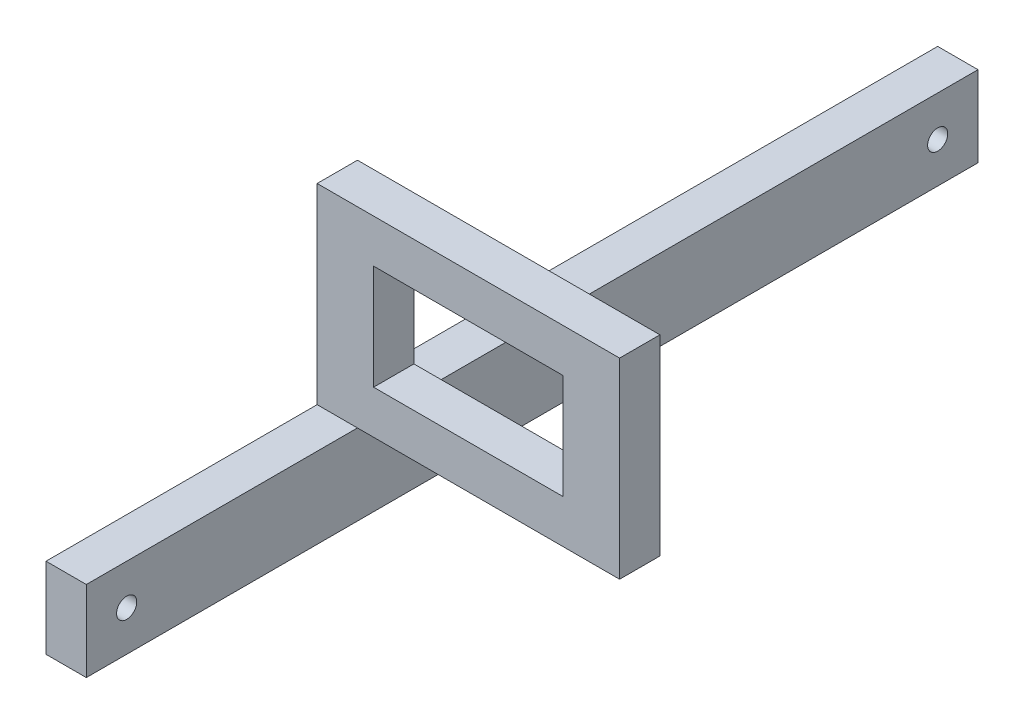
ISO-10303-21;
HEADER;
FILE_DESCRIPTION(('STEP AP214'),'2;1');
FILE_NAME('part.step','',(''),(''),'','','');
FILE_SCHEMA(('AUTOMOTIVE_DESIGN { 1 0 10303 214 1 1 1 1 }'));
ENDSEC;
DATA;
#1=APPLICATION_CONTEXT('core data for automotive mechanical design processes');
#2=APPLICATION_PROTOCOL_DEFINITION('international standard','automotive_design',2000,#1);
#3=PRODUCT_CONTEXT('',#1,'mechanical');
#4=PRODUCT('Part','Part','',(#3));
#5=PRODUCT_RELATED_PRODUCT_CATEGORY('part','',(#4));
#6=PRODUCT_DEFINITION_FORMATION('','',#4);
#7=PRODUCT_DEFINITION_CONTEXT('part definition',#1,'design');
#8=PRODUCT_DEFINITION('design','',#6,#7);
#9=PRODUCT_DEFINITION_SHAPE('','',#8);
#10=(LENGTH_UNIT() NAMED_UNIT(*) SI_UNIT(.MILLI.,.METRE.));
#11=(NAMED_UNIT(*) PLANE_ANGLE_UNIT() SI_UNIT($,.RADIAN.));
#12=(NAMED_UNIT(*) SI_UNIT($,.STERADIAN.) SOLID_ANGLE_UNIT());
#13=UNCERTAINTY_MEASURE_WITH_UNIT(LENGTH_MEASURE(1.E-05),#10,'distance_accuracy_value','');
#14=(GEOMETRIC_REPRESENTATION_CONTEXT(3) GLOBAL_UNCERTAINTY_ASSIGNED_CONTEXT((#13)) GLOBAL_UNIT_ASSIGNED_CONTEXT((#10,
#11,#12)) REPRESENTATION_CONTEXT('',''));
#15=CARTESIAN_POINT('',(0.,0.,0.));
#16=DIRECTION('',(0.,0.,1.));
#17=DIRECTION('',(1.,0.,0.));
#18=AXIS2_PLACEMENT_3D('',#15,#16,#17);
#19=CARTESIAN_POINT('',(19.0499999999999,-12.0649999999999,5.08));
#20=DIRECTION('',(0.,-0.999999999999999,0.));
#21=DIRECTION('',(0.999999999999999,0.,0.));
#22=AXIS2_PLACEMENT_3D('',#19,#20,#21);
#23=PLANE('',#22);
#24=DIRECTION('',(-0.999999999999999,0.,0.));
#25=VECTOR('',#24,1.);
#26=CARTESIAN_POINT('',(19.0499999999999,-12.0649999999999,5.08));
#27=LINE('',#26,#25);
#28=CARTESIAN_POINT('',(19.0499999999999,-12.0649999999999,5.08));
#29=VERTEX_POINT('',#28);
#30=CARTESIAN_POINT('',(-13.97,-12.0649999999999,5.07999999999999));
#31=VERTEX_POINT('',#30);
#32=EDGE_CURVE('E222',#29,#31,#27,.T.);
#33=ORIENTED_EDGE('',*,*,#32,.T.);
#34=DIRECTION('',(0.,0.,-1.));
#35=VECTOR('',#34,1.);
#36=CARTESIAN_POINT('',(-13.9700000000001,-12.0649999999999,50.5940276411528));
#37=LINE('',#36,#35);
#38=CARTESIAN_POINT('',(-13.9700000000001,-12.065,0.));
#39=VERTEX_POINT('',#38);
#40=EDGE_CURVE('E11',#31,#39,#37,.T.);
#41=ORIENTED_EDGE('',*,*,#40,.T.);
#42=DIRECTION('',(-0.999999999999999,0.,0.));
#43=VECTOR('',#42,1.);
#44=CARTESIAN_POINT('',(19.0499999999998,-12.065,0.));
#45=LINE('',#44,#43);
#46=CARTESIAN_POINT('',(19.0499999999998,-12.065,0.));
#47=VERTEX_POINT('',#46);
#48=EDGE_CURVE('E216',#47,#39,#45,.T.);
#49=ORIENTED_EDGE('',*,*,#48,.F.);
#50=DIRECTION('',(0.,0.,-1.));
#51=VECTOR('',#50,1.);
#52=CARTESIAN_POINT('',(19.0499999999999,-12.0649999999999,5.08));
#53=LINE('',#52,#51);
#54=EDGE_CURVE('E225',#29,#47,#53,.T.);
#55=ORIENTED_EDGE('',*,*,#54,.F.);
#56=EDGE_LOOP('',(#33,#41,#49,#55));
#57=FACE_BOUND('',#56,.T.);
#58=ADVANCED_FACE('F38',(#57),#23,.T.);
#59=CARTESIAN_POINT('',(19.0499999999999,-12.0649999999999,5.08));
#60=DIRECTION('',(-0.999999999999999,0.,0.));
#61=DIRECTION('',(0.,0.,1.));
#62=AXIS2_PLACEMENT_3D('',#59,#60,#61);
#63=PLANE('',#62);
#64=DIRECTION('',(0.,0.999999999999999,0.));
#65=VECTOR('',#64,1.);
#66=CARTESIAN_POINT('',(19.0499999999998,-12.065,0.));
#67=LINE('',#66,#65);
#68=CARTESIAN_POINT('',(19.05,12.065,0.));
#69=VERTEX_POINT('',#68);
#70=EDGE_CURVE('E206',#47,#69,#67,.T.);
#71=ORIENTED_EDGE('',*,*,#70,.T.);
#72=DIRECTION('',(0.,0.,-1.));
#73=VECTOR('',#72,1.);
#74=CARTESIAN_POINT('',(19.0499999999999,12.0650000000001,5.07999999999999));
#75=LINE('',#74,#73);
#76=CARTESIAN_POINT('',(19.0499999999999,12.0650000000001,5.07999999999999));
#77=VERTEX_POINT('',#76);
#78=EDGE_CURVE('E42',#77,#69,#75,.T.);
#79=ORIENTED_EDGE('',*,*,#78,.F.);
#80=DIRECTION('',(0.,0.999999999999999,0.));
#81=VECTOR('',#80,1.);
#82=CARTESIAN_POINT('',(19.0499999999999,-12.0649999999999,5.08));
#83=LINE('',#82,#81);
#84=EDGE_CURVE('E212',#29,#77,#83,.T.);
#85=ORIENTED_EDGE('',*,*,#84,.F.);
#86=ORIENTED_EDGE('',*,*,#54,.T.);
#87=EDGE_LOOP('',(#71,#79,#85,#86));
#88=FACE_BOUND('',#87,.T.);
#89=ADVANCED_FACE('F40',(#88),#63,.F.);
#90=CARTESIAN_POINT('',(19.0499999999999,12.0650000000001,5.07999999999999));
#91=DIRECTION('',(0.,-0.999999999999999,0.));
#92=DIRECTION('',(0.999999999999999,0.,0.));
#93=AXIS2_PLACEMENT_3D('',#90,#91,#92);
#94=PLANE('',#93);
#95=DIRECTION('',(-0.999999999999999,0.,0.));
#96=VECTOR('',#95,1.);
#97=CARTESIAN_POINT('',(19.05,12.065,0.));
#98=LINE('',#97,#96);
#99=CARTESIAN_POINT('',(-19.0500000000001,12.0650000000001,0.));
#100=VERTEX_POINT('',#99);
#101=EDGE_CURVE('E228',#69,#100,#98,.T.);
#102=ORIENTED_EDGE('',*,*,#101,.T.);
#103=DIRECTION('',(0.,0.,-1.));
#104=VECTOR('',#103,1.);
#105=CARTESIAN_POINT('',(-19.0500000000001,12.0650000000001,5.08));
#106=LINE('',#105,#104);
#107=CARTESIAN_POINT('',(-19.0500000000001,12.0650000000001,5.08));
#108=VERTEX_POINT('',#107);
#109=EDGE_CURVE('E235',#108,#100,#106,.T.);
#110=ORIENTED_EDGE('',*,*,#109,.F.);
#111=DIRECTION('',(-0.999999999999999,0.,0.));
#112=VECTOR('',#111,1.);
#113=CARTESIAN_POINT('',(19.0499999999999,12.0650000000001,5.07999999999999));
#114=LINE('',#113,#112);
#115=EDGE_CURVE('E215',#77,#108,#114,.T.);
#116=ORIENTED_EDGE('',*,*,#115,.F.);
#117=ORIENTED_EDGE('',*,*,#78,.T.);
#118=EDGE_LOOP('',(#102,#110,#116,#117));
#119=FACE_BOUND('',#118,.T.);
#120=ADVANCED_FACE('F240',(#119),#94,.F.);
#121=CARTESIAN_POINT('',(-19.05,-12.0649999999999,5.08000000000001));
#122=DIRECTION('',(-0.999999999999999,0.,0.));
#123=DIRECTION('',(0.,0.,1.));
#124=AXIS2_PLACEMENT_3D('',#121,#122,#123);
#125=PLANE('',#124);
#126=CARTESIAN_POINT('',(-19.05,-17.1449999999999,-68.0077195465461));
#127=DIRECTION('',(-0.999999999999999,0.,0.));
#128=DIRECTION('',(0.,0.,1.));
#129=AXIS2_PLACEMENT_3D('',#126,#127,#128);
#130=CIRCLE('',#129,1.26999999999999);
#131=CARTESIAN_POINT('',(-19.05,-17.1449999999999,-66.7377195465461));
#132=VERTEX_POINT('',#131);
#133=EDGE_CURVE('E267',#132,#132,#130,.T.);
#134=ORIENTED_EDGE('',*,*,#133,.F.);
#135=EDGE_LOOP('',(#134));
#136=FACE_BOUND('',#135,.T.);
#137=CARTESIAN_POINT('',(-19.05,-17.1449999999999,34.1548023154539));
#138=DIRECTION('',(-0.999999999999999,0.,0.));
#139=DIRECTION('',(0.,0.,1.));
#140=AXIS2_PLACEMENT_3D('',#137,#138,#139);
#141=CIRCLE('',#140,1.27);
#142=CARTESIAN_POINT('',(-19.05,-17.1449999999999,35.4248023154539));
#143=VERTEX_POINT('',#142);
#144=EDGE_CURVE('E264',#143,#143,#141,.T.);
#145=ORIENTED_EDGE('',*,*,#144,.F.);
#146=EDGE_LOOP('',(#145));
#147=FACE_BOUND('',#146,.T.);
#148=DIRECTION('',(0.,0.999999999999999,0.));
#149=VECTOR('',#148,1.);
#150=CARTESIAN_POINT('',(-19.05,-12.0649999999999,0.));
#151=LINE('',#150,#149);
#152=CARTESIAN_POINT('',(-19.05,-12.0649999999999,0.));
#153=VERTEX_POINT('',#152);
#154=EDGE_CURVE('E141',#153,#100,#151,.T.);
#155=ORIENTED_EDGE('',*,*,#154,.F.);
#156=DIRECTION('',(0.,0.,-1.));
#157=VECTOR('',#156,1.);
#158=CARTESIAN_POINT('',(-19.0500000000001,-12.0649999999999,50.5940276411529));
#159=LINE('',#158,#157);
#160=CARTESIAN_POINT('',(-19.0499999999999,-12.0649999999999,-73.0877195465461));
#161=VERTEX_POINT('',#160);
#162=EDGE_CURVE('E135',#153,#161,#159,.T.);
#163=ORIENTED_EDGE('',*,*,#162,.T.);
#164=DIRECTION('',(0.,0.999999999999999,0.));
#165=VECTOR('',#164,1.);
#166=CARTESIAN_POINT('',(-19.0499999999999,-12.0649999999999,-73.0877195465461));
#167=LINE('',#166,#165);
#168=CARTESIAN_POINT('',(-19.05,-22.2249999999999,-73.0877195465461));
#169=VERTEX_POINT('',#168);
#170=EDGE_CURVE('E139',#169,#161,#167,.T.);
#171=ORIENTED_EDGE('',*,*,#170,.F.);
#172=DIRECTION('',(0.,0.,-1.));
#173=VECTOR('',#172,1.);
#174=CARTESIAN_POINT('',(-19.0500000000001,-22.2249999999998,50.5940276411529));
#175=LINE('',#174,#173);
#176=CARTESIAN_POINT('',(-19.05,-22.2249999999999,39.234802315454));
#177=VERTEX_POINT('',#176);
#178=EDGE_CURVE('E146',#177,#169,#175,.T.);
#179=ORIENTED_EDGE('',*,*,#178,.F.);
#180=DIRECTION('',(0.,0.999999999999999,0.));
#181=VECTOR('',#180,1.);
#182=CARTESIAN_POINT('',(-19.0500000000001,-12.065,39.234802315454));
#183=LINE('',#182,#181);
#184=CARTESIAN_POINT('',(-19.0500000000001,-12.065,39.234802315454));
#185=VERTEX_POINT('',#184);
#186=EDGE_CURVE('E166',#177,#185,#183,.T.);
#187=ORIENTED_EDGE('',*,*,#186,.T.);
#188=CARTESIAN_POINT('',(-19.05,-12.0649999999999,5.08000000000002));
#189=VERTEX_POINT('',#188);
#190=EDGE_CURVE('E145',#185,#189,#159,.T.);
#191=ORIENTED_EDGE('',*,*,#190,.T.);
#192=DIRECTION('',(0.,0.999999999999999,0.));
#193=VECTOR('',#192,1.);
#194=CARTESIAN_POINT('',(-19.05,-12.0649999999999,5.08000000000001));
#195=LINE('',#194,#193);
#196=EDGE_CURVE('E218',#189,#108,#195,.T.);
#197=ORIENTED_EDGE('',*,*,#196,.T.);
#198=ORIENTED_EDGE('',*,*,#109,.T.);
#199=EDGE_LOOP('',(#155,#163,#171,#179,#187,#191,#197,#198));
#200=FACE_BOUND('',#199,.T.);
#201=ADVANCED_FACE('F137',(#136,#147,#200),#125,.T.);
#202=CARTESIAN_POINT('',(-1.11022302462516E-13,1.2490009027033E-13,5.07999999999999));
#203=DIRECTION('',(0.,0.,1.));
#204=DIRECTION('',(0.999999999999999,0.,0.));
#205=AXIS2_PLACEMENT_3D('',#202,#203,#204);
#206=PLANE('',#205);
#207=DIRECTION('',(0.,0.999999999999999,0.));
#208=VECTOR('',#207,1.);
#209=CARTESIAN_POINT('',(11.9379999999999,-6.60399999999989,5.07999999999997));
#210=LINE('',#209,#208);
#211=CARTESIAN_POINT('',(11.9379999999999,-6.60399999999989,5.07999999999997));
#212=VERTEX_POINT('',#211);
#213=CARTESIAN_POINT('',(11.9379999999999,6.60400000000014,5.08));
#214=VERTEX_POINT('',#213);
#215=EDGE_CURVE('E63',#212,#214,#210,.T.);
#216=ORIENTED_EDGE('',*,*,#215,.F.);
#217=DIRECTION('',(0.999999999999999,0.,0.));
#218=VECTOR('',#217,1.);
#219=CARTESIAN_POINT('',(-11.938,-6.60399999999986,5.08));
#220=LINE('',#219,#218);
#221=CARTESIAN_POINT('',(-11.938,-6.60399999999986,5.08));
#222=VERTEX_POINT('',#221);
#223=EDGE_CURVE('E185',#222,#212,#220,.T.);
#224=ORIENTED_EDGE('',*,*,#223,.F.);
#225=DIRECTION('',(0.,-0.999999999999999,0.));
#226=VECTOR('',#225,1.);
#227=CARTESIAN_POINT('',(-11.938,-6.60399999999986,5.08));
#228=LINE('',#227,#226);
#229=CARTESIAN_POINT('',(-11.9380000000001,6.60400000000012,5.08));
#230=VERTEX_POINT('',#229);
#231=EDGE_CURVE('E199',#230,#222,#228,.T.);
#232=ORIENTED_EDGE('',*,*,#231,.F.);
#233=DIRECTION('',(-0.999999999999999,0.,0.));
#234=VECTOR('',#233,1.);
#235=CARTESIAN_POINT('',(-11.9380000000001,6.60400000000012,5.08));
#236=LINE('',#235,#234);
#237=EDGE_CURVE('E196',#214,#230,#236,.T.);
#238=ORIENTED_EDGE('',*,*,#237,.F.);
#239=EDGE_LOOP('',(#216,#224,#232,#238));
#240=FACE_BOUND('',#239,.T.);
#241=ORIENTED_EDGE('',*,*,#84,.T.);
#242=ORIENTED_EDGE('',*,*,#115,.T.);
#243=ORIENTED_EDGE('',*,*,#196,.F.);
#244=EDGE_CURVE('E221',#31,#189,#27,.T.);
#245=ORIENTED_EDGE('',*,*,#244,.F.);
#246=ORIENTED_EDGE('',*,*,#32,.F.);
#247=EDGE_LOOP('',(#241,#242,#243,#245,#246));
#248=FACE_BOUND('',#247,.T.);
#249=ADVANCED_FACE('F257',(#240,#248),#206,.T.);
#250=CARTESIAN_POINT('',(0.,0.,0.));
#251=DIRECTION('',(0.,0.,1.));
#252=DIRECTION('',(0.999999999999999,0.,0.));
#253=AXIS2_PLACEMENT_3D('',#250,#251,#252);
#254=PLANE('',#253);
#255=DIRECTION('',(0.999999999999999,0.,0.));
#256=VECTOR('',#255,1.);
#257=CARTESIAN_POINT('',(-11.938,-6.60399999999986,0.));
#258=LINE('',#257,#256);
#259=CARTESIAN_POINT('',(-11.938,-6.60399999999986,0.));
#260=VERTEX_POINT('',#259);
#261=CARTESIAN_POINT('',(11.9379999999999,-6.60399999999989,0.));
#262=VERTEX_POINT('',#261);
#263=EDGE_CURVE('E191',#260,#262,#258,.T.);
#264=ORIENTED_EDGE('',*,*,#263,.T.);
#265=DIRECTION('',(0.,0.999999999999999,0.));
#266=VECTOR('',#265,1.);
#267=CARTESIAN_POINT('',(11.9379999999999,-6.60399999999989,0.));
#268=LINE('',#267,#266);
#269=CARTESIAN_POINT('',(11.9379999999999,6.60400000000003,0.));
#270=VERTEX_POINT('',#269);
#271=EDGE_CURVE('E181',#262,#270,#268,.T.);
#272=ORIENTED_EDGE('',*,*,#271,.T.);
#273=DIRECTION('',(-0.999999999999999,0.,0.));
#274=VECTOR('',#273,1.);
#275=CARTESIAN_POINT('',(-11.938,6.604,0.));
#276=LINE('',#275,#274);
#277=CARTESIAN_POINT('',(-11.938,6.604,0.));
#278=VERTEX_POINT('',#277);
#279=EDGE_CURVE('E184',#270,#278,#276,.T.);
#280=ORIENTED_EDGE('',*,*,#279,.T.);
#281=DIRECTION('',(0.,-0.999999999999999,0.));
#282=VECTOR('',#281,1.);
#283=CARTESIAN_POINT('',(-11.938,-6.60399999999986,0.));
#284=LINE('',#283,#282);
#285=EDGE_CURVE('E188',#278,#260,#284,.T.);
#286=ORIENTED_EDGE('',*,*,#285,.T.);
#287=EDGE_LOOP('',(#264,#272,#280,#286));
#288=FACE_BOUND('',#287,.T.);
#289=ORIENTED_EDGE('',*,*,#70,.F.);
#290=ORIENTED_EDGE('',*,*,#48,.T.);
#291=EDGE_CURVE('E232',#39,#153,#45,.T.);
#292=ORIENTED_EDGE('',*,*,#291,.T.);
#293=ORIENTED_EDGE('',*,*,#154,.T.);
#294=ORIENTED_EDGE('',*,*,#101,.F.);
#295=EDGE_LOOP('',(#289,#290,#292,#293,#294));
#296=FACE_BOUND('',#295,.T.);
#297=ADVANCED_FACE('F246',(#288,#296),#254,.F.);
#298=CARTESIAN_POINT('',(11.9379999999999,-6.60399999999989,0.));
#299=DIRECTION('',(0.999999999999999,0.,0.));
#300=DIRECTION('',(0.,0.,-1.));
#301=AXIS2_PLACEMENT_3D('',#298,#299,#300);
#302=PLANE('',#301);
#303=ORIENTED_EDGE('',*,*,#215,.T.);
#304=DIRECTION('',(0.,0.,1.));
#305=VECTOR('',#304,1.);
#306=CARTESIAN_POINT('',(11.9379999999999,6.60400000000003,0.));
#307=LINE('',#306,#305);
#308=EDGE_CURVE('E194',#270,#214,#307,.T.);
#309=ORIENTED_EDGE('',*,*,#308,.F.);
#310=ORIENTED_EDGE('',*,*,#271,.F.);
#311=DIRECTION('',(0.,0.,1.));
#312=VECTOR('',#311,1.);
#313=CARTESIAN_POINT('',(11.9379999999999,-6.60399999999989,0.));
#314=LINE('',#313,#312);
#315=EDGE_CURVE('E204',#262,#212,#314,.T.);
#316=ORIENTED_EDGE('',*,*,#315,.T.);
#317=EDGE_LOOP('',(#303,#309,#310,#316));
#318=FACE_BOUND('',#317,.T.);
#319=ADVANCED_FACE('F322',(#318),#302,.F.);
#320=CARTESIAN_POINT('',(-11.938,-6.60399999999986,0.));
#321=DIRECTION('',(0.,-0.999999999999999,0.));
#322=DIRECTION('',(0.,0.,-1.));
#323=AXIS2_PLACEMENT_3D('',#320,#321,#322);
#324=PLANE('',#323);
#325=ORIENTED_EDGE('',*,*,#223,.T.);
#326=ORIENTED_EDGE('',*,*,#315,.F.);
#327=ORIENTED_EDGE('',*,*,#263,.F.);
#328=DIRECTION('',(0.,0.,1.));
#329=VECTOR('',#328,1.);
#330=CARTESIAN_POINT('',(-11.938,-6.60399999999986,0.));
#331=LINE('',#330,#329);
#332=EDGE_CURVE('E207',#260,#222,#331,.T.);
#333=ORIENTED_EDGE('',*,*,#332,.T.);
#334=EDGE_LOOP('',(#325,#326,#327,#333));
#335=FACE_BOUND('',#334,.T.);
#336=ADVANCED_FACE('F329',(#335),#324,.F.);
#337=CARTESIAN_POINT('',(-11.938,-6.60399999999986,0.));
#338=DIRECTION('',(-0.999999999999999,0.,0.));
#339=DIRECTION('',(0.,0.,1.));
#340=AXIS2_PLACEMENT_3D('',#337,#338,#339);
#341=PLANE('',#340);
#342=ORIENTED_EDGE('',*,*,#231,.T.);
#343=ORIENTED_EDGE('',*,*,#332,.F.);
#344=ORIENTED_EDGE('',*,*,#285,.F.);
#345=DIRECTION('',(0.,0.,1.));
#346=VECTOR('',#345,1.);
#347=CARTESIAN_POINT('',(-11.938,6.604,0.));
#348=LINE('',#347,#346);
#349=EDGE_CURVE('E209',#278,#230,#348,.T.);
#350=ORIENTED_EDGE('',*,*,#349,.T.);
#351=EDGE_LOOP('',(#342,#343,#344,#350));
#352=FACE_BOUND('',#351,.T.);
#353=ADVANCED_FACE('F336',(#352),#341,.F.);
#354=CARTESIAN_POINT('',(-11.938,6.604,0.));
#355=DIRECTION('',(0.,0.999999999999999,0.));
#356=DIRECTION('',(0.,0.,1.));
#357=AXIS2_PLACEMENT_3D('',#354,#355,#356);
#358=PLANE('',#357);
#359=ORIENTED_EDGE('',*,*,#237,.T.);
#360=ORIENTED_EDGE('',*,*,#349,.F.);
#361=ORIENTED_EDGE('',*,*,#279,.F.);
#362=ORIENTED_EDGE('',*,*,#308,.T.);
#363=EDGE_LOOP('',(#359,#360,#361,#362));
#364=FACE_BOUND('',#363,.T.);
#365=ADVANCED_FACE('F344',(#364),#358,.F.);
#366=CARTESIAN_POINT('',(-19.0500000000001,-12.0649999999999,50.5940276411529));
#367=DIRECTION('',(0.,-0.999999999999999,0.));
#368=DIRECTION('',(0.999999999999999,0.,0.));
#369=AXIS2_PLACEMENT_3D('',#366,#367,#368);
#370=PLANE('',#369);
#371=CARTESIAN_POINT('',(-13.9700000000001,-12.0649999999999,39.2348023154539));
#372=VERTEX_POINT('',#371);
#373=EDGE_CURVE('E48',#372,#31,#37,.T.);
#374=ORIENTED_EDGE('',*,*,#373,.T.);
#375=ORIENTED_EDGE('',*,*,#244,.T.);
#376=ORIENTED_EDGE('',*,*,#190,.F.);
#377=DIRECTION('',(0.999999999999999,0.,0.));
#378=VECTOR('',#377,1.);
#379=CARTESIAN_POINT('',(-19.0500000000001,-12.065,39.234802315454));
#380=LINE('',#379,#378);
#381=EDGE_CURVE('E169',#185,#372,#380,.T.);
#382=ORIENTED_EDGE('',*,*,#381,.T.);
#383=EDGE_LOOP('',(#374,#375,#376,#382));
#384=FACE_BOUND('',#383,.T.);
#385=ADVANCED_FACE('F253',(#384),#370,.F.);
#386=CARTESIAN_POINT('',(-19.0500000000001,-22.2249999999998,50.5940276411529));
#387=DIRECTION('',(0.,0.999999999999999,0.));
#388=DIRECTION('',(0.,0.,1.));
#389=AXIS2_PLACEMENT_3D('',#386,#387,#388);
#390=PLANE('',#389);
#391=DIRECTION('',(0.,0.,-1.));
#392=VECTOR('',#391,1.);
#393=CARTESIAN_POINT('',(-13.9700000000001,-22.2249999999999,50.5940276411528));
#394=LINE('',#393,#392);
#395=CARTESIAN_POINT('',(-13.9700000000001,-22.2249999999999,39.2348023154539));
#396=VERTEX_POINT('',#395);
#397=CARTESIAN_POINT('',(-13.97,-22.2249999999999,-73.0877195465461));
#398=VERTEX_POINT('',#397);
#399=EDGE_CURVE('E159',#396,#398,#394,.T.);
#400=ORIENTED_EDGE('',*,*,#399,.F.);
#401=DIRECTION('',(-0.999999999999999,0.,0.));
#402=VECTOR('',#401,1.);
#403=CARTESIAN_POINT('',(-19.05,-22.2249999999999,39.234802315454));
#404=LINE('',#403,#402);
#405=EDGE_CURVE('E170',#396,#177,#404,.T.);
#406=ORIENTED_EDGE('',*,*,#405,.T.);
#407=ORIENTED_EDGE('',*,*,#178,.T.);
#408=DIRECTION('',(-0.999999999999999,0.,0.));
#409=VECTOR('',#408,1.);
#410=CARTESIAN_POINT('',(-19.05,-22.2249999999999,-73.0877195465461));
#411=LINE('',#410,#409);
#412=EDGE_CURVE('E155',#398,#169,#411,.T.);
#413=ORIENTED_EDGE('',*,*,#412,.F.);
#414=EDGE_LOOP('',(#400,#406,#407,#413));
#415=FACE_BOUND('',#414,.T.);
#416=ADVANCED_FACE('F262',(#415),#390,.F.);
#417=ORIENTED_EDGE('',*,*,#291,.F.);
#418=CARTESIAN_POINT('',(-13.97,-12.0649999999999,-73.0877195465461));
#419=VERTEX_POINT('',#418);
#420=EDGE_CURVE('E49',#39,#419,#37,.T.);
#421=ORIENTED_EDGE('',*,*,#420,.T.);
#422=DIRECTION('',(0.999999999999999,0.,0.));
#423=VECTOR('',#422,1.);
#424=CARTESIAN_POINT('',(-19.0499999999999,-12.0649999999999,-73.0877195465461));
#425=LINE('',#424,#423);
#426=EDGE_CURVE('E153',#161,#419,#425,.T.);
#427=ORIENTED_EDGE('',*,*,#426,.F.);
#428=ORIENTED_EDGE('',*,*,#162,.F.);
#429=EDGE_LOOP('',(#417,#421,#427,#428));
#430=FACE_BOUND('',#429,.T.);
#431=ADVANCED_FACE('F158',(#430),#370,.F.);
#432=CARTESIAN_POINT('',(-13.9700000000001,-12.0649999999999,50.5940276411528));
#433=DIRECTION('',(-0.999999999999999,0.,0.));
#434=DIRECTION('',(0.,0.,1.));
#435=AXIS2_PLACEMENT_3D('',#432,#433,#434);
#436=PLANE('',#435);
#437=CARTESIAN_POINT('',(-13.97,-17.1449999999999,-68.0077195465461));
#438=DIRECTION('',(-0.999999999999999,0.,0.));
#439=DIRECTION('',(0.,0.,1.));
#440=AXIS2_PLACEMENT_3D('',#437,#438,#439);
#441=CIRCLE('',#440,1.26999999999999);
#442=CARTESIAN_POINT('',(-13.97,-17.1449999999999,-66.7377195465461));
#443=VERTEX_POINT('',#442);
#444=EDGE_CURVE('E156',#443,#443,#441,.F.);
#445=ORIENTED_EDGE('',*,*,#444,.F.);
#446=EDGE_LOOP('',(#445));
#447=FACE_BOUND('',#446,.T.);
#448=CARTESIAN_POINT('',(-13.97,-17.1449999999999,34.1548023154539));
#449=DIRECTION('',(-0.999999999999999,0.,0.));
#450=DIRECTION('',(0.,0.,1.));
#451=AXIS2_PLACEMENT_3D('',#448,#449,#450);
#452=CIRCLE('',#451,1.27);
#453=CARTESIAN_POINT('',(-13.97,-17.1449999999999,35.4248023154539));
#454=VERTEX_POINT('',#453);
#455=EDGE_CURVE('E268',#454,#454,#452,.F.);
#456=ORIENTED_EDGE('',*,*,#455,.F.);
#457=EDGE_LOOP('',(#456));
#458=FACE_BOUND('',#457,.T.);
#459=ORIENTED_EDGE('',*,*,#373,.F.);
#460=DIRECTION('',(0.,-0.999999999999999,0.));
#461=VECTOR('',#460,1.);
#462=CARTESIAN_POINT('',(-13.9700000000001,-12.0649999999999,39.2348023154539));
#463=LINE('',#462,#461);
#464=EDGE_CURVE('E173',#372,#396,#463,.T.);
#465=ORIENTED_EDGE('',*,*,#464,.T.);
#466=ORIENTED_EDGE('',*,*,#399,.T.);
#467=DIRECTION('',(0.,-0.999999999999999,0.));
#468=VECTOR('',#467,1.);
#469=CARTESIAN_POINT('',(-13.97,-12.0649999999999,-73.0877195465461));
#470=LINE('',#469,#468);
#471=EDGE_CURVE('E160',#419,#398,#470,.T.);
#472=ORIENTED_EDGE('',*,*,#471,.F.);
#473=ORIENTED_EDGE('',*,*,#420,.F.);
#474=ORIENTED_EDGE('',*,*,#40,.F.);
#475=EDGE_LOOP('',(#459,#465,#466,#472,#473,#474));
#476=FACE_BOUND('',#475,.T.);
#477=ADVANCED_FACE('F250',(#447,#458,#476),#436,.F.);
#478=CARTESIAN_POINT('',(-17.2720000000001,26.9931062296957,39.234802315454));
#479=DIRECTION('',(0.,0.,-1.));
#480=DIRECTION('',(-0.999999999999999,0.,0.));
#481=AXIS2_PLACEMENT_3D('',#478,#479,#480);
#482=PLANE('',#481);
#483=ORIENTED_EDGE('',*,*,#381,.F.);
#484=ORIENTED_EDGE('',*,*,#186,.F.);
#485=ORIENTED_EDGE('',*,*,#405,.F.);
#486=ORIENTED_EDGE('',*,*,#464,.F.);
#487=EDGE_LOOP('',(#483,#484,#485,#486));
#488=FACE_BOUND('',#487,.T.);
#489=ADVANCED_FACE('F259',(#488),#482,.F.);
#490=CARTESIAN_POINT('',(-17.2720000000001,26.9931062296958,-73.087719546546));
#491=DIRECTION('',(0.,0.,1.));
#492=DIRECTION('',(0.999999999999999,0.,0.));
#493=AXIS2_PLACEMENT_3D('',#490,#491,#492);
#494=PLANE('',#493);
#495=ORIENTED_EDGE('',*,*,#471,.T.);
#496=ORIENTED_EDGE('',*,*,#412,.T.);
#497=ORIENTED_EDGE('',*,*,#170,.T.);
#498=ORIENTED_EDGE('',*,*,#426,.T.);
#499=EDGE_LOOP('',(#495,#496,#497,#498));
#500=FACE_BOUND('',#499,.T.);
#501=ADVANCED_FACE('F152',(#500),#494,.F.);
#502=CARTESIAN_POINT('',(-10.3778975515725,-17.1449999999999,34.1548023154539));
#503=DIRECTION('',(-0.999999999999999,0.,0.));
#504=DIRECTION('',(0.,0.,1.));
#505=AXIS2_PLACEMENT_3D('',#502,#503,#504);
#506=CYLINDRICAL_SURFACE('',#505,1.27);
#507=CARTESIAN_POINT('',(-13.97,-17.1449999999999,35.4248023154539));
#508=CARTESIAN_POINT('',(-14.0229166666667,-17.1449999999999,35.4248023154539));
#509=CARTESIAN_POINT('',(-14.0758333333333,-17.1449999999999,35.4248023154539));
#510=CARTESIAN_POINT('',(-14.1816666666667,-17.1449999999999,35.4248023154539));
#511=CARTESIAN_POINT('',(-14.2345833333333,-17.1449999999999,35.4248023154539));
#512=CARTESIAN_POINT('',(-14.3404166666667,-17.1449999999999,35.4248023154539));
#513=CARTESIAN_POINT('',(-14.3933333333333,-17.1449999999999,35.4248023154539));
#514=CARTESIAN_POINT('',(-14.4991666666667,-17.1449999999999,35.4248023154539));
#515=CARTESIAN_POINT('',(-14.5520833333333,-17.1449999999999,35.4248023154539));
#516=CARTESIAN_POINT('',(-14.6579166666667,-17.1449999999999,35.4248023154539));
#517=CARTESIAN_POINT('',(-14.7108333333333,-17.1449999999999,35.4248023154539));
#518=CARTESIAN_POINT('',(-14.8166666666667,-17.1449999999999,35.4248023154539));
#519=CARTESIAN_POINT('',(-14.8695833333333,-17.1449999999999,35.4248023154539));
#520=CARTESIAN_POINT('',(-14.9754166666667,-17.1449999999999,35.4248023154539));
#521=CARTESIAN_POINT('',(-15.0283333333333,-17.1449999999999,35.4248023154539));
#522=CARTESIAN_POINT('',(-15.1341666666667,-17.1449999999999,35.4248023154539));
#523=CARTESIAN_POINT('',(-15.1870833333333,-17.1449999999999,35.4248023154539));
#524=CARTESIAN_POINT('',(-15.2929166666667,-17.1449999999999,35.4248023154539));
#525=CARTESIAN_POINT('',(-15.3458333333334,-17.1449999999999,35.4248023154539));
#526=CARTESIAN_POINT('',(-15.4516666666667,-17.1449999999999,35.4248023154539));
#527=CARTESIAN_POINT('',(-15.5045833333334,-17.1449999999999,35.4248023154539));
#528=CARTESIAN_POINT('',(-15.6104166666667,-17.1449999999999,35.4248023154539));
#529=CARTESIAN_POINT('',(-15.6633333333334,-17.1449999999999,35.4248023154539));
#530=CARTESIAN_POINT('',(-15.7691666666667,-17.1449999999999,35.4248023154539));
#531=CARTESIAN_POINT('',(-15.8220833333334,-17.1449999999999,35.4248023154539));
#532=CARTESIAN_POINT('',(-15.9279166666667,-17.1449999999999,35.4248023154539));
#533=CARTESIAN_POINT('',(-15.9808333333334,-17.1449999999999,35.4248023154539));
#534=CARTESIAN_POINT('',(-16.0866666666667,-17.1449999999999,35.4248023154539));
#535=CARTESIAN_POINT('',(-16.1395833333334,-17.1449999999999,35.4248023154539));
#536=CARTESIAN_POINT('',(-16.2454166666667,-17.1449999999999,35.4248023154539));
#537=CARTESIAN_POINT('',(-16.2983333333334,-17.1449999999999,35.4248023154539));
#538=CARTESIAN_POINT('',(-16.4041666666667,-17.1449999999999,35.4248023154539));
#539=CARTESIAN_POINT('',(-16.4570833333334,-17.1449999999999,35.4248023154539));
#540=CARTESIAN_POINT('',(-16.5629166666667,-17.1449999999999,35.4248023154539));
#541=CARTESIAN_POINT('',(-16.6158333333334,-17.1449999999999,35.4248023154539));
#542=CARTESIAN_POINT('',(-16.7216666666667,-17.1449999999999,35.4248023154539));
#543=CARTESIAN_POINT('',(-16.7745833333334,-17.1449999999999,35.4248023154539));
#544=CARTESIAN_POINT('',(-16.8804166666667,-17.1449999999999,35.4248023154539));
#545=CARTESIAN_POINT('',(-16.9333333333334,-17.1449999999999,35.4248023154539));
#546=CARTESIAN_POINT('',(-17.0391666666667,-17.1449999999999,35.4248023154539));
#547=CARTESIAN_POINT('',(-17.0920833333334,-17.1449999999999,35.4248023154539));
#548=CARTESIAN_POINT('',(-17.1979166666667,-17.1449999999999,35.4248023154539));
#549=CARTESIAN_POINT('',(-17.2508333333334,-17.1449999999999,35.4248023154539));
#550=CARTESIAN_POINT('',(-17.3566666666667,-17.1449999999999,35.4248023154539));
#551=CARTESIAN_POINT('',(-17.4095833333334,-17.1449999999999,35.4248023154539));
#552=CARTESIAN_POINT('',(-17.5154166666667,-17.1449999999999,35.4248023154539));
#553=CARTESIAN_POINT('',(-17.5683333333334,-17.1449999999999,35.4248023154539));
#554=CARTESIAN_POINT('',(-17.6741666666667,-17.1449999999999,35.4248023154539));
#555=CARTESIAN_POINT('',(-17.7270833333334,-17.1449999999999,35.4248023154539));
#556=CARTESIAN_POINT('',(-17.8329166666667,-17.1449999999999,35.4248023154539));
#557=CARTESIAN_POINT('',(-17.8858333333334,-17.1449999999999,35.4248023154539));
#558=CARTESIAN_POINT('',(-17.9916666666667,-17.1449999999999,35.4248023154539));
#559=CARTESIAN_POINT('',(-18.0445833333334,-17.1449999999999,35.4248023154539));
#560=CARTESIAN_POINT('',(-18.1504166666667,-17.1449999999999,35.4248023154539));
#561=CARTESIAN_POINT('',(-18.2033333333334,-17.1449999999999,35.4248023154539));
#562=CARTESIAN_POINT('',(-18.3091666666667,-17.1449999999999,35.4248023154539));
#563=CARTESIAN_POINT('',(-18.3620833333334,-17.1449999999999,35.4248023154539));
#564=CARTESIAN_POINT('',(-18.4679166666667,-17.1449999999999,35.4248023154539));
#565=CARTESIAN_POINT('',(-18.5208333333334,-17.1449999999999,35.4248023154539));
#566=CARTESIAN_POINT('',(-18.6266666666667,-17.1449999999999,35.4248023154539));
#567=CARTESIAN_POINT('',(-18.6795833333334,-17.1449999999999,35.4248023154539));
#568=CARTESIAN_POINT('',(-18.7854166666667,-17.1449999999999,35.4248023154539));
#569=CARTESIAN_POINT('',(-18.8383333333334,-17.1449999999999,35.4248023154539));
#570=CARTESIAN_POINT('',(-18.9441666666667,-17.1449999999999,35.4248023154539));
#571=CARTESIAN_POINT('',(-18.9970833333334,-17.1449999999999,35.4248023154539));
#572=CARTESIAN_POINT('',(-19.05,-17.1449999999999,35.4248023154539));
#573=B_SPLINE_CURVE_WITH_KNOTS('',3,(#507,#508,#509,#510,#511,#512,#513,#514,#515,#516,#517,
#518,#519,#520,#521,#522,#523,#524,#525,#526,#527,#528,#529,#530,#531,#532,#533,#534,#535,#536,
#537,#538,#539,#540,#541,#542,#543,#544,#545,#546,#547,#548,#549,#550,#551,#552,#553,#554,#555,
#556,#557,#558,#559,#560,#561,#562,#563,#564,#565,#566,#567,#568,#569,#570,#571,#572),
.UNSPECIFIED.,.F.,.F.,(4,2,2,2,2,2,2,2,2,2,2,2,2,2,2,2,2,2,2,2,2,2,2,2,2,2,2,2,2,2,2,2,4),(0.,
0.158750000000001,0.317500000000002,0.476250000000003,0.635000000000004,0.793750000000005,
0.952500000000005,1.11125000000001,1.27000000000001,1.42875000000001,1.58750000000001,
1.74625000000001,1.90500000000001,2.06375000000001,2.22250000000001,2.38125000000001,
2.54000000000002,2.69875000000002,2.85750000000001,3.01625000000002,3.17500000000002,
3.33375000000002,3.49250000000002,3.65125000000002,3.81000000000002,3.96875000000002,
4.12750000000002,4.28625000000002,4.44500000000002,4.60375000000003,4.76250000000003,
4.92125000000002,5.08000000000003),.UNSPECIFIED.);
#574=EDGE_CURVE('BSEAM283',#454,#143,#573,.T.);
#575=ORIENTED_EDGE('',*,*,#455,.T.);
#576=ORIENTED_EDGE('',*,*,#144,.T.);
#577=ORIENTED_EDGE('',*,*,#574,.T.);
#578=ORIENTED_EDGE('',*,*,#574,.F.);
#579=EDGE_LOOP('',(#575,#577,#576,#578));
#580=FACE_BOUND('',#579,.T.);
#581=ADVANCED_FACE('F283',(#580),#506,.F.);
#582=CARTESIAN_POINT('',(-10.3778975515723,-17.1449999999999,-68.0077195465461));
#583=DIRECTION('',(-0.999999999999999,0.,0.));
#584=DIRECTION('',(0.,0.,1.));
#585=AXIS2_PLACEMENT_3D('',#582,#583,#584);
#586=CYLINDRICAL_SURFACE('',#585,1.26999999999999);
#587=CARTESIAN_POINT('',(-13.97,-17.1449999999999,-66.7377195465461));
#588=CARTESIAN_POINT('',(-14.0229166666667,-17.1449999999999,-66.7377195465461));
#589=CARTESIAN_POINT('',(-14.0758333333333,-17.1449999999999,-66.7377195465461));
#590=CARTESIAN_POINT('',(-14.1816666666667,-17.1449999999999,-66.7377195465461));
#591=CARTESIAN_POINT('',(-14.2345833333333,-17.1449999999999,-66.7377195465461));
#592=CARTESIAN_POINT('',(-14.3404166666667,-17.1449999999999,-66.7377195465461));
#593=CARTESIAN_POINT('',(-14.3933333333333,-17.1449999999999,-66.7377195465461));
#594=CARTESIAN_POINT('',(-14.4991666666667,-17.1449999999999,-66.7377195465461));
#595=CARTESIAN_POINT('',(-14.5520833333333,-17.1449999999999,-66.7377195465461));
#596=CARTESIAN_POINT('',(-14.6579166666667,-17.1449999999999,-66.7377195465461));
#597=CARTESIAN_POINT('',(-14.7108333333333,-17.1449999999999,-66.7377195465461));
#598=CARTESIAN_POINT('',(-14.8166666666667,-17.1449999999999,-66.7377195465461));
#599=CARTESIAN_POINT('',(-14.8695833333333,-17.1449999999999,-66.7377195465461));
#600=CARTESIAN_POINT('',(-14.9754166666667,-17.1449999999999,-66.7377195465461));
#601=CARTESIAN_POINT('',(-15.0283333333333,-17.1449999999999,-66.7377195465461));
#602=CARTESIAN_POINT('',(-15.1341666666667,-17.1449999999999,-66.7377195465461));
#603=CARTESIAN_POINT('',(-15.1870833333333,-17.1449999999999,-66.7377195465461));
#604=CARTESIAN_POINT('',(-15.2929166666667,-17.1449999999999,-66.7377195465461));
#605=CARTESIAN_POINT('',(-15.3458333333334,-17.1449999999999,-66.7377195465461));
#606=CARTESIAN_POINT('',(-15.4516666666667,-17.1449999999999,-66.7377195465461));
#607=CARTESIAN_POINT('',(-15.5045833333334,-17.1449999999999,-66.7377195465461));
#608=CARTESIAN_POINT('',(-15.6104166666667,-17.1449999999999,-66.7377195465461));
#609=CARTESIAN_POINT('',(-15.6633333333334,-17.1449999999999,-66.7377195465461));
#610=CARTESIAN_POINT('',(-15.7691666666667,-17.1449999999999,-66.7377195465461));
#611=CARTESIAN_POINT('',(-15.8220833333334,-17.1449999999999,-66.7377195465461));
#612=CARTESIAN_POINT('',(-15.9279166666667,-17.1449999999999,-66.7377195465461));
#613=CARTESIAN_POINT('',(-15.9808333333334,-17.1449999999999,-66.7377195465461));
#614=CARTESIAN_POINT('',(-16.0866666666667,-17.1449999999999,-66.7377195465461));
#615=CARTESIAN_POINT('',(-16.1395833333334,-17.1449999999999,-66.7377195465461));
#616=CARTESIAN_POINT('',(-16.2454166666667,-17.1449999999999,-66.7377195465461));
#617=CARTESIAN_POINT('',(-16.2983333333334,-17.1449999999999,-66.7377195465461));
#618=CARTESIAN_POINT('',(-16.4041666666667,-17.1449999999999,-66.7377195465461));
#619=CARTESIAN_POINT('',(-16.4570833333334,-17.1449999999999,-66.7377195465461));
#620=CARTESIAN_POINT('',(-16.5629166666667,-17.1449999999999,-66.7377195465461));
#621=CARTESIAN_POINT('',(-16.6158333333334,-17.1449999999999,-66.7377195465461));
#622=CARTESIAN_POINT('',(-16.7216666666667,-17.1449999999999,-66.7377195465461));
#623=CARTESIAN_POINT('',(-16.7745833333334,-17.1449999999999,-66.7377195465461));
#624=CARTESIAN_POINT('',(-16.8804166666667,-17.1449999999999,-66.7377195465461));
#625=CARTESIAN_POINT('',(-16.9333333333334,-17.1449999999999,-66.7377195465461));
#626=CARTESIAN_POINT('',(-17.0391666666667,-17.1449999999999,-66.7377195465461));
#627=CARTESIAN_POINT('',(-17.0920833333334,-17.1449999999999,-66.7377195465461));
#628=CARTESIAN_POINT('',(-17.1979166666667,-17.1449999999999,-66.7377195465461));
#629=CARTESIAN_POINT('',(-17.2508333333334,-17.1449999999999,-66.7377195465461));
#630=CARTESIAN_POINT('',(-17.3566666666667,-17.1449999999999,-66.7377195465461));
#631=CARTESIAN_POINT('',(-17.4095833333334,-17.1449999999999,-66.7377195465461));
#632=CARTESIAN_POINT('',(-17.5154166666667,-17.1449999999999,-66.7377195465461));
#633=CARTESIAN_POINT('',(-17.5683333333334,-17.1449999999999,-66.7377195465461));
#634=CARTESIAN_POINT('',(-17.6741666666667,-17.1449999999999,-66.7377195465461));
#635=CARTESIAN_POINT('',(-17.7270833333334,-17.1449999999999,-66.7377195465461));
#636=CARTESIAN_POINT('',(-17.8329166666667,-17.1449999999999,-66.7377195465461));
#637=CARTESIAN_POINT('',(-17.8858333333334,-17.1449999999999,-66.7377195465461));
#638=CARTESIAN_POINT('',(-17.9916666666667,-17.1449999999999,-66.7377195465461));
#639=CARTESIAN_POINT('',(-18.0445833333334,-17.1449999999999,-66.7377195465461));
#640=CARTESIAN_POINT('',(-18.1504166666667,-17.1449999999999,-66.7377195465461));
#641=CARTESIAN_POINT('',(-18.2033333333334,-17.1449999999999,-66.7377195465461));
#642=CARTESIAN_POINT('',(-18.3091666666667,-17.1449999999999,-66.7377195465461));
#643=CARTESIAN_POINT('',(-18.3620833333334,-17.1449999999999,-66.7377195465461));
#644=CARTESIAN_POINT('',(-18.4679166666667,-17.1449999999999,-66.7377195465461));
#645=CARTESIAN_POINT('',(-18.5208333333334,-17.1449999999999,-66.7377195465461));
#646=CARTESIAN_POINT('',(-18.6266666666667,-17.1449999999999,-66.7377195465461));
#647=CARTESIAN_POINT('',(-18.6795833333334,-17.1449999999999,-66.7377195465461));
#648=CARTESIAN_POINT('',(-18.7854166666667,-17.1449999999999,-66.7377195465461));
#649=CARTESIAN_POINT('',(-18.8383333333334,-17.1449999999999,-66.7377195465461));
#650=CARTESIAN_POINT('',(-18.9441666666667,-17.1449999999999,-66.7377195465461));
#651=CARTESIAN_POINT('',(-18.9970833333334,-17.1449999999999,-66.7377195465461));
#652=CARTESIAN_POINT('',(-19.05,-17.1449999999999,-66.7377195465461));
#653=B_SPLINE_CURVE_WITH_KNOTS('',3,(#587,#588,#589,#590,#591,#592,#593,#594,#595,#596,#597,
#598,#599,#600,#601,#602,#603,#604,#605,#606,#607,#608,#609,#610,#611,#612,#613,#614,#615,#616,
#617,#618,#619,#620,#621,#622,#623,#624,#625,#626,#627,#628,#629,#630,#631,#632,#633,#634,#635,
#636,#637,#638,#639,#640,#641,#642,#643,#644,#645,#646,#647,#648,#649,#650,#651,#652),
.UNSPECIFIED.,.F.,.F.,(4,2,2,2,2,2,2,2,2,2,2,2,2,2,2,2,2,2,2,2,2,2,2,2,2,2,2,2,2,2,2,2,4),(0.,
0.158750000000001,0.317500000000002,0.476250000000003,0.635000000000004,0.793750000000005,
0.952500000000005,1.11125000000001,1.27000000000001,1.42875000000001,1.58750000000001,
1.74625000000001,1.90500000000001,2.06375000000001,2.22250000000001,2.38125000000001,
2.54000000000002,2.69875000000002,2.85750000000001,3.01625000000002,3.17500000000002,
3.33375000000002,3.49250000000002,3.65125000000002,3.81000000000002,3.96875000000002,
4.12750000000002,4.28625000000002,4.44500000000002,4.60375000000003,4.76250000000003,
4.92125000000002,5.08000000000003),.UNSPECIFIED.);
#654=EDGE_CURVE('BSEAM276',#443,#132,#653,.T.);
#655=ORIENTED_EDGE('',*,*,#444,.T.);
#656=ORIENTED_EDGE('',*,*,#133,.T.);
#657=ORIENTED_EDGE('',*,*,#654,.T.);
#658=ORIENTED_EDGE('',*,*,#654,.F.);
#659=EDGE_LOOP('',(#655,#657,#656,#658));
#660=FACE_BOUND('',#659,.T.);
#661=ADVANCED_FACE('F276',(#660),#586,.F.);
#662=CLOSED_SHELL('',(#58,#89,#120,#201,#249,#297,#319,#336,#353,#365,#385,#416,#431,#477,#489,
#501,#581,#661));
#663=MANIFOLD_SOLID_BREP('B2',#662);
#664=ADVANCED_BREP_SHAPE_REPRESENTATION('',(#18,#663),#14);
#665=SHAPE_DEFINITION_REPRESENTATION(#9,#664);
ENDSEC;
END-ISO-10303-21;
